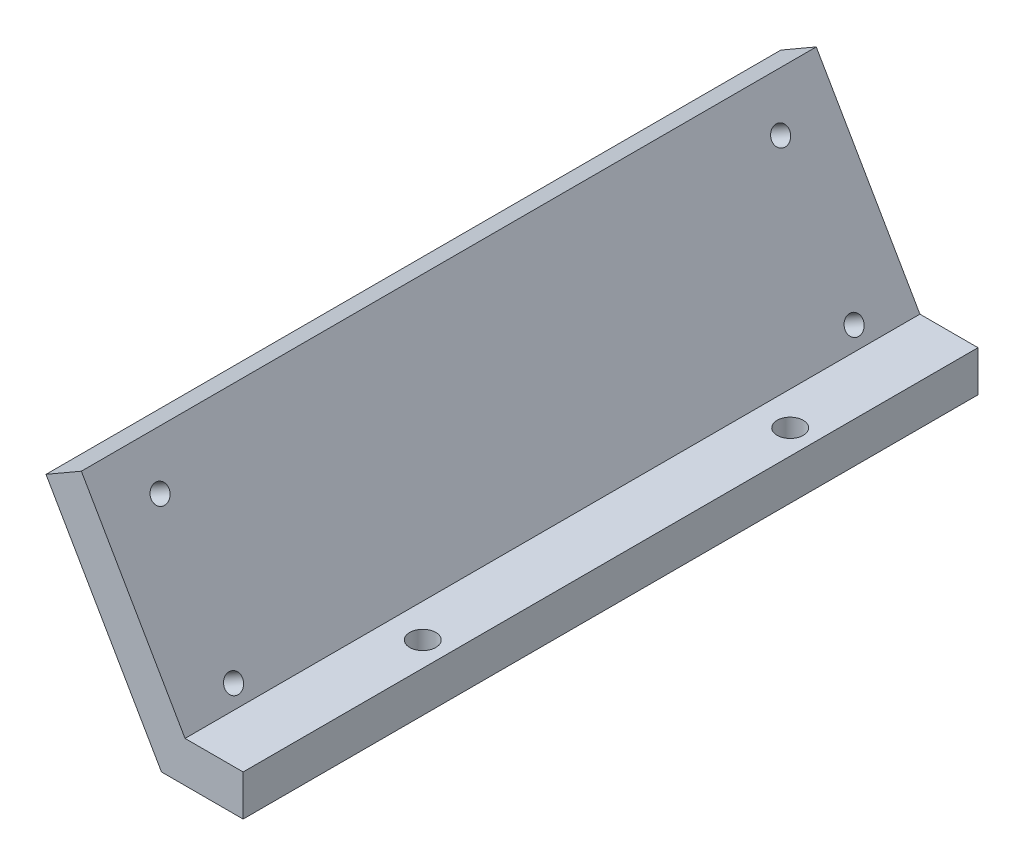
ISO-10303-21;
HEADER;
FILE_DESCRIPTION(('STEP AP214'),'2;1');
FILE_NAME('part.step','',(''),(''),'','','');
FILE_SCHEMA(('AUTOMOTIVE_DESIGN { 1 0 10303 214 1 1 1 1 }'));
ENDSEC;
DATA;
#1=APPLICATION_CONTEXT('core data for automotive mechanical design processes');
#2=APPLICATION_PROTOCOL_DEFINITION('international standard','automotive_design',2000,#1);
#3=PRODUCT_CONTEXT('',#1,'mechanical');
#4=PRODUCT('Part','Part','',(#3));
#5=PRODUCT_RELATED_PRODUCT_CATEGORY('part','',(#4));
#6=PRODUCT_DEFINITION_FORMATION('','',#4);
#7=PRODUCT_DEFINITION_CONTEXT('part definition',#1,'design');
#8=PRODUCT_DEFINITION('design','',#6,#7);
#9=PRODUCT_DEFINITION_SHAPE('','',#8);
#10=(LENGTH_UNIT() NAMED_UNIT(*) SI_UNIT(.MILLI.,.METRE.));
#11=(NAMED_UNIT(*) PLANE_ANGLE_UNIT() SI_UNIT($,.RADIAN.));
#12=(NAMED_UNIT(*) SI_UNIT($,.STERADIAN.) SOLID_ANGLE_UNIT());
#13=UNCERTAINTY_MEASURE_WITH_UNIT(LENGTH_MEASURE(1.E-05),#10,'distance_accuracy_value','');
#14=(GEOMETRIC_REPRESENTATION_CONTEXT(3) GLOBAL_UNCERTAINTY_ASSIGNED_CONTEXT((#13)) GLOBAL_UNIT_ASSIGNED_CONTEXT((#10,
#11,#12)) REPRESENTATION_CONTEXT('',''));
#15=CARTESIAN_POINT('',(0.,0.,0.));
#16=DIRECTION('',(0.,0.,1.));
#17=DIRECTION('',(1.,0.,0.));
#18=AXIS2_PLACEMENT_3D('',#15,#16,#17);
#19=CARTESIAN_POINT('',(0.,0.,90.));
#20=DIRECTION('',(0.,1.,0.));
#21=DIRECTION('',(0.,0.,1.));
#22=AXIS2_PLACEMENT_3D('',#19,#20,#21);
#23=PLANE('',#22);
#24=CARTESIAN_POINT('',(7.,0.,20.));
#25=DIRECTION('',(0.,1.,0.));
#26=DIRECTION('',(0.,0.,1.));
#27=AXIS2_PLACEMENT_3D('',#24,#25,#26);
#28=CIRCLE('',#27,1.6);
#29=CARTESIAN_POINT('',(7.,0.,21.6));
#30=VERTEX_POINT('',#29);
#31=EDGE_CURVE('E123',#30,#30,#28,.T.);
#32=ORIENTED_EDGE('',*,*,#31,.T.);
#33=EDGE_LOOP('',(#32));
#34=FACE_BOUND('',#33,.T.);
#35=CARTESIAN_POINT('',(7.,0.,65.));
#36=DIRECTION('',(0.,1.,0.));
#37=DIRECTION('',(0.,0.,1.));
#38=AXIS2_PLACEMENT_3D('',#35,#36,#37);
#39=CIRCLE('',#38,1.6);
#40=CARTESIAN_POINT('',(7.,0.,66.6));
#41=VERTEX_POINT('',#40);
#42=EDGE_CURVE('E167',#41,#41,#39,.T.);
#43=ORIENTED_EDGE('',*,*,#42,.T.);
#44=EDGE_LOOP('',(#43));
#45=FACE_BOUND('',#44,.T.);
#46=DIRECTION('',(1.,0.,0.));
#47=VECTOR('',#46,1.);
#48=CARTESIAN_POINT('',(0.,0.,0.));
#49=LINE('',#48,#47);
#50=CARTESIAN_POINT('',(0.,0.,0.));
#51=VERTEX_POINT('',#50);
#52=CARTESIAN_POINT('',(10.,0.,0.));
#53=VERTEX_POINT('',#52);
#54=EDGE_CURVE('E119',#51,#53,#49,.T.);
#55=ORIENTED_EDGE('',*,*,#54,.T.);
#56=DIRECTION('',(0.,0.,-1.));
#57=VECTOR('',#56,1.);
#58=CARTESIAN_POINT('',(10.,0.,90.));
#59=LINE('',#58,#57);
#60=CARTESIAN_POINT('',(10.,0.,90.));
#61=VERTEX_POINT('',#60);
#62=EDGE_CURVE('E11',#61,#53,#59,.T.);
#63=ORIENTED_EDGE('',*,*,#62,.F.);
#64=DIRECTION('',(1.,0.,0.));
#65=VECTOR('',#64,1.);
#66=CARTESIAN_POINT('',(0.,0.,90.));
#67=LINE('',#66,#65);
#68=CARTESIAN_POINT('',(0.,0.,90.));
#69=VERTEX_POINT('',#68);
#70=EDGE_CURVE('E130',#69,#61,#67,.T.);
#71=ORIENTED_EDGE('',*,*,#70,.F.);
#72=DIRECTION('',(0.,0.,-1.));
#73=VECTOR('',#72,1.);
#74=CARTESIAN_POINT('',(0.,0.,90.));
#75=LINE('',#74,#73);
#76=EDGE_CURVE('E115',#69,#51,#75,.T.);
#77=ORIENTED_EDGE('',*,*,#76,.T.);
#78=EDGE_LOOP('',(#55,#63,#71,#77));
#79=FACE_BOUND('',#78,.T.);
#80=ADVANCED_FACE('F35',(#34,#45,#79),#23,.F.);
#81=CARTESIAN_POINT('',(10.,5.,90.));
#82=DIRECTION('',(-1.,0.,0.));
#83=DIRECTION('',(0.,0.,1.));
#84=AXIS2_PLACEMENT_3D('',#81,#82,#83);
#85=PLANE('',#84);
#86=DIRECTION('',(0.,1.,0.));
#87=VECTOR('',#86,1.);
#88=CARTESIAN_POINT('',(10.,5.,0.));
#89=LINE('',#88,#87);
#90=CARTESIAN_POINT('',(10.,5.,0.));
#91=VERTEX_POINT('',#90);
#92=EDGE_CURVE('E122',#53,#91,#89,.T.);
#93=ORIENTED_EDGE('',*,*,#92,.T.);
#94=DIRECTION('',(0.,0.,-1.));
#95=VECTOR('',#94,1.);
#96=CARTESIAN_POINT('',(10.,5.,90.));
#97=LINE('',#96,#95);
#98=CARTESIAN_POINT('',(10.,5.,90.));
#99=VERTEX_POINT('',#98);
#100=EDGE_CURVE('E43',#99,#91,#97,.T.);
#101=ORIENTED_EDGE('',*,*,#100,.F.);
#102=DIRECTION('',(0.,1.,0.));
#103=VECTOR('',#102,1.);
#104=CARTESIAN_POINT('',(10.,5.,90.));
#105=LINE('',#104,#103);
#106=EDGE_CURVE('E88',#61,#99,#105,.T.);
#107=ORIENTED_EDGE('',*,*,#106,.F.);
#108=ORIENTED_EDGE('',*,*,#62,.T.);
#109=EDGE_LOOP('',(#93,#101,#107,#108));
#110=FACE_BOUND('',#109,.T.);
#111=ADVANCED_FACE('F157',(#110),#85,.F.);
#112=CARTESIAN_POINT('',(2.88675134594811,5.,90.));
#113=DIRECTION('',(0.,-1.,0.));
#114=DIRECTION('',(0.,0.,-1.));
#115=AXIS2_PLACEMENT_3D('',#112,#113,#114);
#116=PLANE('',#115);
#117=CARTESIAN_POINT('',(7.,5.,20.));
#118=DIRECTION('',(0.,1.,0.));
#119=DIRECTION('',(0.,0.,1.));
#120=AXIS2_PLACEMENT_3D('',#117,#118,#119);
#121=CIRCLE('',#120,1.6);
#122=CARTESIAN_POINT('',(7.,5.,21.6));
#123=VERTEX_POINT('',#122);
#124=EDGE_CURVE('E169',#123,#123,#121,.T.);
#125=ORIENTED_EDGE('',*,*,#124,.F.);
#126=EDGE_LOOP('',(#125));
#127=FACE_BOUND('',#126,.T.);
#128=CARTESIAN_POINT('',(7.,5.,65.));
#129=DIRECTION('',(0.,1.,0.));
#130=DIRECTION('',(0.,0.,1.));
#131=AXIS2_PLACEMENT_3D('',#128,#129,#130);
#132=CIRCLE('',#131,1.6);
#133=CARTESIAN_POINT('',(7.,5.,66.6));
#134=VERTEX_POINT('',#133);
#135=EDGE_CURVE('E173',#134,#134,#132,.T.);
#136=ORIENTED_EDGE('',*,*,#135,.F.);
#137=EDGE_LOOP('',(#136));
#138=FACE_BOUND('',#137,.T.);
#139=DIRECTION('',(-1.,0.,0.));
#140=VECTOR('',#139,1.);
#141=CARTESIAN_POINT('',(2.88675134594811,5.,0.));
#142=LINE('',#141,#140);
#143=CARTESIAN_POINT('',(2.88675134594811,5.,0.));
#144=VERTEX_POINT('',#143);
#145=EDGE_CURVE('E125',#91,#144,#142,.T.);
#146=ORIENTED_EDGE('',*,*,#145,.T.);
#147=DIRECTION('',(0.,0.,-1.));
#148=VECTOR('',#147,1.);
#149=CARTESIAN_POINT('',(2.88675134594811,5.,90.));
#150=LINE('',#149,#148);
#151=CARTESIAN_POINT('',(2.88675134594811,5.,90.));
#152=VERTEX_POINT('',#151);
#153=EDGE_CURVE('E110',#152,#144,#150,.T.);
#154=ORIENTED_EDGE('',*,*,#153,.F.);
#155=DIRECTION('',(-1.,0.,0.));
#156=VECTOR('',#155,1.);
#157=CARTESIAN_POINT('',(2.88675134594811,5.,90.));
#158=LINE('',#157,#156);
#159=EDGE_CURVE('E101',#99,#152,#158,.T.);
#160=ORIENTED_EDGE('',*,*,#159,.F.);
#161=ORIENTED_EDGE('',*,*,#100,.T.);
#162=EDGE_LOOP('',(#146,#154,#160,#161));
#163=FACE_BOUND('',#162,.T.);
#164=ADVANCED_FACE('F136',(#127,#138,#163),#116,.F.);
#165=CARTESIAN_POINT('',(2.88675134594811,5.,90.));
#166=DIRECTION('',(-0.866025403784436,-0.500000000000004,0.));
#167=DIRECTION('',(0.500000000000004,-0.866025403784436,0.));
#168=AXIS2_PLACEMENT_3D('',#165,#166,#167);
#169=PLANE('',#168);
#170=CARTESIAN_POINT('',(1.83012701892216,6.83012701892221,7.00000000000019));
#171=DIRECTION('',(-0.866025403784436,-0.500000000000004,0.));
#172=DIRECTION('',(0.500000000000004,-0.866025403784436,0.));
#173=AXIS2_PLACEMENT_3D('',#170,#171,#172);
#174=CIRCLE('',#173,1.1);
#175=CARTESIAN_POINT('',(2.38012701892216,5.87749907475932,7.00000000000019));
#176=VERTEX_POINT('',#175);
#177=EDGE_CURVE('E179',#176,#176,#174,.T.);
#178=ORIENTED_EDGE('',*,*,#177,.T.);
#179=EDGE_LOOP('',(#178));
#180=FACE_BOUND('',#179,.T.);
#181=CARTESIAN_POINT('',(1.83012701892216,6.83012701892221,83.0000000000002));
#182=DIRECTION('',(-0.866025403784436,-0.500000000000004,0.));
#183=DIRECTION('',(0.500000000000004,-0.866025403784436,0.));
#184=AXIS2_PLACEMENT_3D('',#181,#182,#183);
#185=CIRCLE('',#184,1.10000000000001);
#186=CARTESIAN_POINT('',(2.38012701892217,5.87749907475932,83.0000000000002));
#187=VERTEX_POINT('',#186);
#188=EDGE_CURVE('E183',#187,#187,#185,.T.);
#189=ORIENTED_EDGE('',*,*,#188,.T.);
#190=EDGE_LOOP('',(#189));
#191=FACE_BOUND('',#190,.T.);
#192=CARTESIAN_POINT('',(-7.16987298107792,22.4185842870421,83.));
#193=DIRECTION('',(-0.866025403784436,-0.500000000000004,0.));
#194=DIRECTION('',(0.500000000000004,-0.866025403784436,0.));
#195=AXIS2_PLACEMENT_3D('',#192,#193,#194);
#196=CIRCLE('',#195,1.10000000000001);
#197=CARTESIAN_POINT('',(-6.61987298107791,21.4659563428792,83.));
#198=VERTEX_POINT('',#197);
#199=EDGE_CURVE('E186',#198,#198,#196,.T.);
#200=ORIENTED_EDGE('',*,*,#199,.T.);
#201=EDGE_LOOP('',(#200));
#202=FACE_BOUND('',#201,.T.);
#203=CARTESIAN_POINT('',(-7.16987298107792,22.4185842870421,7.));
#204=DIRECTION('',(-0.866025403784436,-0.500000000000004,0.));
#205=DIRECTION('',(0.500000000000004,-0.866025403784436,0.));
#206=AXIS2_PLACEMENT_3D('',#203,#204,#205);
#207=CIRCLE('',#206,1.1);
#208=CARTESIAN_POINT('',(-6.61987298107791,21.4659563428792,7.));
#209=VERTEX_POINT('',#208);
#210=EDGE_CURVE('E189',#209,#209,#207,.T.);
#211=ORIENTED_EDGE('',*,*,#210,.T.);
#212=EDGE_LOOP('',(#211));
#213=FACE_BOUND('',#212,.T.);
#214=DIRECTION('',(-0.500000000000004,0.866025403784436,0.));
#215=VECTOR('',#214,1.);
#216=CARTESIAN_POINT('',(2.88675134594811,5.,0.));
#217=LINE('',#216,#215);
#218=CARTESIAN_POINT('',(-9.8120086048089,26.9948974278317,0.));
#219=VERTEX_POINT('',#218);
#220=EDGE_CURVE('E109',#144,#219,#217,.T.);
#221=ORIENTED_EDGE('',*,*,#220,.T.);
#222=DIRECTION('',(0.,0.,-1.));
#223=VECTOR('',#222,1.);
#224=CARTESIAN_POINT('',(-9.8120086048089,26.9948974278317,90.));
#225=LINE('',#224,#223);
#226=CARTESIAN_POINT('',(-9.8120086048089,26.9948974278317,90.));
#227=VERTEX_POINT('',#226);
#228=EDGE_CURVE('E106',#227,#219,#225,.T.);
#229=ORIENTED_EDGE('',*,*,#228,.F.);
#230=DIRECTION('',(-0.500000000000004,0.866025403784436,0.));
#231=VECTOR('',#230,1.);
#232=CARTESIAN_POINT('',(2.88675134594811,5.,90.));
#233=LINE('',#232,#231);
#234=EDGE_CURVE('E95',#152,#227,#233,.T.);
#235=ORIENTED_EDGE('',*,*,#234,.F.);
#236=ORIENTED_EDGE('',*,*,#153,.T.);
#237=EDGE_LOOP('',(#221,#229,#235,#236));
#238=FACE_BOUND('',#237,.T.);
#239=ADVANCED_FACE('F107',(#180,#191,#202,#213,#238),#169,.F.);
#240=CARTESIAN_POINT('',(-9.8120086048089,26.9948974278317,90.));
#241=DIRECTION('',(0.500000000000006,-0.866025403784435,0.));
#242=DIRECTION('',(0.866025403784435,0.500000000000006,0.));
#243=AXIS2_PLACEMENT_3D('',#240,#241,#242);
#244=PLANE('',#243);
#245=DIRECTION('',(-0.866025403784435,-0.500000000000006,0.));
#246=VECTOR('',#245,1.);
#247=CARTESIAN_POINT('',(-9.8120086048089,26.9948974278317,0.));
#248=LINE('',#247,#246);
#249=CARTESIAN_POINT('',(-14.1421356237311,24.4948974278317,0.));
#250=VERTEX_POINT('',#249);
#251=EDGE_CURVE('E74',#219,#250,#248,.T.);
#252=ORIENTED_EDGE('',*,*,#251,.T.);
#253=DIRECTION('',(0.,0.,-1.));
#254=VECTOR('',#253,1.);
#255=CARTESIAN_POINT('',(-14.1421356237311,24.4948974278317,90.));
#256=LINE('',#255,#254);
#257=CARTESIAN_POINT('',(-14.1421356237311,24.4948974278317,90.));
#258=VERTEX_POINT('',#257);
#259=EDGE_CURVE('E111',#258,#250,#256,.T.);
#260=ORIENTED_EDGE('',*,*,#259,.F.);
#261=DIRECTION('',(-0.866025403784435,-0.500000000000006,0.));
#262=VECTOR('',#261,1.);
#263=CARTESIAN_POINT('',(-9.8120086048089,26.9948974278317,90.));
#264=LINE('',#263,#262);
#265=EDGE_CURVE('E99',#227,#258,#264,.T.);
#266=ORIENTED_EDGE('',*,*,#265,.F.);
#267=ORIENTED_EDGE('',*,*,#228,.T.);
#268=EDGE_LOOP('',(#252,#260,#266,#267));
#269=FACE_BOUND('',#268,.T.);
#270=ADVANCED_FACE('F113',(#269),#244,.F.);
#271=CARTESIAN_POINT('',(0.,0.,90.));
#272=DIRECTION('',(0.866025403784436,0.500000000000004,0.));
#273=DIRECTION('',(-0.500000000000004,0.866025403784436,0.));
#274=AXIS2_PLACEMENT_3D('',#271,#272,#273);
#275=PLANE('',#274);
#276=CARTESIAN_POINT('',(-2.50000000000002,4.33012701892218,7.00000000000019));
#277=DIRECTION('',(-0.866025403784436,-0.500000000000004,0.));
#278=DIRECTION('',(0.500000000000004,-0.866025403784436,0.));
#279=AXIS2_PLACEMENT_3D('',#276,#277,#278);
#280=CIRCLE('',#279,1.1);
#281=CARTESIAN_POINT('',(-1.95000000000002,3.3774990747593,7.00000000000019));
#282=VERTEX_POINT('',#281);
#283=EDGE_CURVE('E196',#282,#282,#280,.T.);
#284=ORIENTED_EDGE('',*,*,#283,.F.);
#285=EDGE_LOOP('',(#284));
#286=FACE_BOUND('',#285,.T.);
#287=CARTESIAN_POINT('',(-2.50000000000002,4.33012701892218,83.0000000000002));
#288=DIRECTION('',(-0.866025403784436,-0.500000000000004,0.));
#289=DIRECTION('',(0.500000000000004,-0.866025403784436,0.));
#290=AXIS2_PLACEMENT_3D('',#287,#288,#289);
#291=CIRCLE('',#290,1.10000000000001);
#292=CARTESIAN_POINT('',(-1.95000000000001,3.3774990747593,83.0000000000002));
#293=VERTEX_POINT('',#292);
#294=EDGE_CURVE('E199',#293,#293,#291,.T.);
#295=ORIENTED_EDGE('',*,*,#294,.F.);
#296=EDGE_LOOP('',(#295));
#297=FACE_BOUND('',#296,.T.);
#298=CARTESIAN_POINT('',(-11.5000000000001,19.918584287042,83.));
#299=DIRECTION('',(-0.866025403784436,-0.500000000000004,0.));
#300=DIRECTION('',(0.500000000000004,-0.866025403784436,0.));
#301=AXIS2_PLACEMENT_3D('',#298,#299,#300);
#302=CIRCLE('',#301,1.10000000000001);
#303=CARTESIAN_POINT('',(-10.9500000000001,18.9659563428792,83.));
#304=VERTEX_POINT('',#303);
#305=EDGE_CURVE('E195',#304,#304,#302,.T.);
#306=ORIENTED_EDGE('',*,*,#305,.F.);
#307=EDGE_LOOP('',(#306));
#308=FACE_BOUND('',#307,.T.);
#309=CARTESIAN_POINT('',(-11.5000000000001,19.918584287042,7.));
#310=DIRECTION('',(-0.866025403784436,-0.500000000000004,0.));
#311=DIRECTION('',(0.500000000000004,-0.866025403784436,0.));
#312=AXIS2_PLACEMENT_3D('',#309,#310,#311);
#313=CIRCLE('',#312,1.1);
#314=CARTESIAN_POINT('',(-10.9500000000001,18.9659563428792,7.));
#315=VERTEX_POINT('',#314);
#316=EDGE_CURVE('E192',#315,#315,#313,.T.);
#317=ORIENTED_EDGE('',*,*,#316,.F.);
#318=EDGE_LOOP('',(#317));
#319=FACE_BOUND('',#318,.T.);
#320=DIRECTION('',(0.500000000000004,-0.866025403784436,0.));
#321=VECTOR('',#320,1.);
#322=CARTESIAN_POINT('',(0.,0.,0.));
#323=LINE('',#322,#321);
#324=EDGE_CURVE('E80',#250,#51,#323,.T.);
#325=ORIENTED_EDGE('',*,*,#324,.T.);
#326=ORIENTED_EDGE('',*,*,#76,.F.);
#327=DIRECTION('',(0.500000000000004,-0.866025403784436,0.));
#328=VECTOR('',#327,1.);
#329=CARTESIAN_POINT('',(0.,0.,90.));
#330=LINE('',#329,#328);
#331=EDGE_CURVE('E51',#258,#69,#330,.T.);
#332=ORIENTED_EDGE('',*,*,#331,.F.);
#333=ORIENTED_EDGE('',*,*,#259,.T.);
#334=EDGE_LOOP('',(#325,#326,#332,#333));
#335=FACE_BOUND('',#334,.T.);
#336=ADVANCED_FACE('F143',(#286,#297,#308,#319,#335),#275,.F.);
#337=CARTESIAN_POINT('',(0.,0.,90.));
#338=DIRECTION('',(0.,0.,-1.));
#339=DIRECTION('',(-1.,0.,0.));
#340=AXIS2_PLACEMENT_3D('',#337,#338,#339);
#341=PLANE('',#340);
#342=ORIENTED_EDGE('',*,*,#70,.T.);
#343=ORIENTED_EDGE('',*,*,#106,.T.);
#344=ORIENTED_EDGE('',*,*,#159,.T.);
#345=ORIENTED_EDGE('',*,*,#234,.T.);
#346=ORIENTED_EDGE('',*,*,#265,.T.);
#347=ORIENTED_EDGE('',*,*,#331,.T.);
#348=EDGE_LOOP('',(#342,#343,#344,#345,#346,#347));
#349=FACE_BOUND('',#348,.T.);
#350=ADVANCED_FACE('F97',(#349),#341,.F.);
#351=CARTESIAN_POINT('',(0.,0.,0.));
#352=DIRECTION('',(0.,0.,-1.));
#353=DIRECTION('',(-1.,0.,0.));
#354=AXIS2_PLACEMENT_3D('',#351,#352,#353);
#355=PLANE('',#354);
#356=ORIENTED_EDGE('',*,*,#54,.F.);
#357=ORIENTED_EDGE('',*,*,#324,.F.);
#358=ORIENTED_EDGE('',*,*,#251,.F.);
#359=ORIENTED_EDGE('',*,*,#220,.F.);
#360=ORIENTED_EDGE('',*,*,#145,.F.);
#361=ORIENTED_EDGE('',*,*,#92,.F.);
#362=EDGE_LOOP('',(#356,#357,#358,#359,#360,#361));
#363=FACE_BOUND('',#362,.T.);
#364=ADVANCED_FACE('F139',(#363),#355,.T.);
#365=CARTESIAN_POINT('',(7.,-5.,65.));
#366=DIRECTION('',(0.,1.,0.));
#367=DIRECTION('',(0.,0.,1.));
#368=AXIS2_PLACEMENT_3D('',#365,#366,#367);
#369=CYLINDRICAL_SURFACE('',#368,1.6);
#370=ORIENTED_EDGE('',*,*,#135,.T.);
#371=EDGE_LOOP('',(#370));
#372=FACE_BOUND('',#371,.T.);
#373=ORIENTED_EDGE('',*,*,#42,.F.);
#374=EDGE_LOOP('',(#373));
#375=FACE_BOUND('',#374,.T.);
#376=ADVANCED_FACE('F246',(#372,#375),#369,.F.);
#377=CARTESIAN_POINT('',(7.,-5.,20.));
#378=DIRECTION('',(0.,1.,0.));
#379=DIRECTION('',(0.,0.,1.));
#380=AXIS2_PLACEMENT_3D('',#377,#378,#379);
#381=CYLINDRICAL_SURFACE('',#380,1.6);
#382=ORIENTED_EDGE('',*,*,#124,.T.);
#383=EDGE_LOOP('',(#382));
#384=FACE_BOUND('',#383,.T.);
#385=ORIENTED_EDGE('',*,*,#31,.F.);
#386=EDGE_LOOP('',(#385));
#387=FACE_BOUND('',#386,.T.);
#388=ADVANCED_FACE('F214',(#384,#387),#381,.F.);
#389=CARTESIAN_POINT('',(-2.83974596215574,24.9185842870421,7.));
#390=DIRECTION('',(-0.866025403784436,-0.500000000000004,0.));
#391=DIRECTION('',(0.500000000000004,-0.866025403784436,0.));
#392=AXIS2_PLACEMENT_3D('',#389,#390,#391);
#393=CYLINDRICAL_SURFACE('',#392,1.1);
#394=ORIENTED_EDGE('',*,*,#316,.T.);
#395=EDGE_LOOP('',(#394));
#396=FACE_BOUND('',#395,.T.);
#397=ORIENTED_EDGE('',*,*,#210,.F.);
#398=EDGE_LOOP('',(#397));
#399=FACE_BOUND('',#398,.T.);
#400=ADVANCED_FACE('F211',(#396,#399),#393,.F.);
#401=CARTESIAN_POINT('',(-2.83974596215574,24.9185842870421,83.));
#402=DIRECTION('',(-0.866025403784436,-0.500000000000004,0.));
#403=DIRECTION('',(0.500000000000004,-0.866025403784436,0.));
#404=AXIS2_PLACEMENT_3D('',#401,#402,#403);
#405=CYLINDRICAL_SURFACE('',#404,1.10000000000001);
#406=ORIENTED_EDGE('',*,*,#305,.T.);
#407=EDGE_LOOP('',(#406));
#408=FACE_BOUND('',#407,.T.);
#409=ORIENTED_EDGE('',*,*,#199,.F.);
#410=EDGE_LOOP('',(#409));
#411=FACE_BOUND('',#410,.T.);
#412=ADVANCED_FACE('F205',(#408,#411),#405,.F.);
#413=CARTESIAN_POINT('',(6.16025403784434,9.33012701892222,83.0000000000002));
#414=DIRECTION('',(-0.866025403784436,-0.500000000000004,0.));
#415=DIRECTION('',(0.500000000000004,-0.866025403784436,0.));
#416=AXIS2_PLACEMENT_3D('',#413,#414,#415);
#417=CYLINDRICAL_SURFACE('',#416,1.10000000000001);
#418=ORIENTED_EDGE('',*,*,#294,.T.);
#419=EDGE_LOOP('',(#418));
#420=FACE_BOUND('',#419,.T.);
#421=ORIENTED_EDGE('',*,*,#188,.F.);
#422=EDGE_LOOP('',(#421));
#423=FACE_BOUND('',#422,.T.);
#424=ADVANCED_FACE('F232',(#420,#423),#417,.F.);
#425=CARTESIAN_POINT('',(6.16025403784434,9.33012701892222,7.00000000000019));
#426=DIRECTION('',(-0.866025403784436,-0.500000000000004,0.));
#427=DIRECTION('',(0.500000000000004,-0.866025403784436,0.));
#428=AXIS2_PLACEMENT_3D('',#425,#426,#427);
#429=CYLINDRICAL_SURFACE('',#428,1.1);
#430=ORIENTED_EDGE('',*,*,#283,.T.);
#431=EDGE_LOOP('',(#430));
#432=FACE_BOUND('',#431,.T.);
#433=ORIENTED_EDGE('',*,*,#177,.F.);
#434=EDGE_LOOP('',(#433));
#435=FACE_BOUND('',#434,.T.);
#436=ADVANCED_FACE('F237',(#432,#435),#429,.F.);
#437=CLOSED_SHELL('',(#80,#111,#164,#239,#270,#336,#350,#364,#376,#388,#400,#412,#424,#436));
#438=MANIFOLD_SOLID_BREP('B2',#437);
#439=ADVANCED_BREP_SHAPE_REPRESENTATION('',(#18,#438),#14);
#440=SHAPE_DEFINITION_REPRESENTATION(#9,#439);
ENDSEC;
END-ISO-10303-21;
